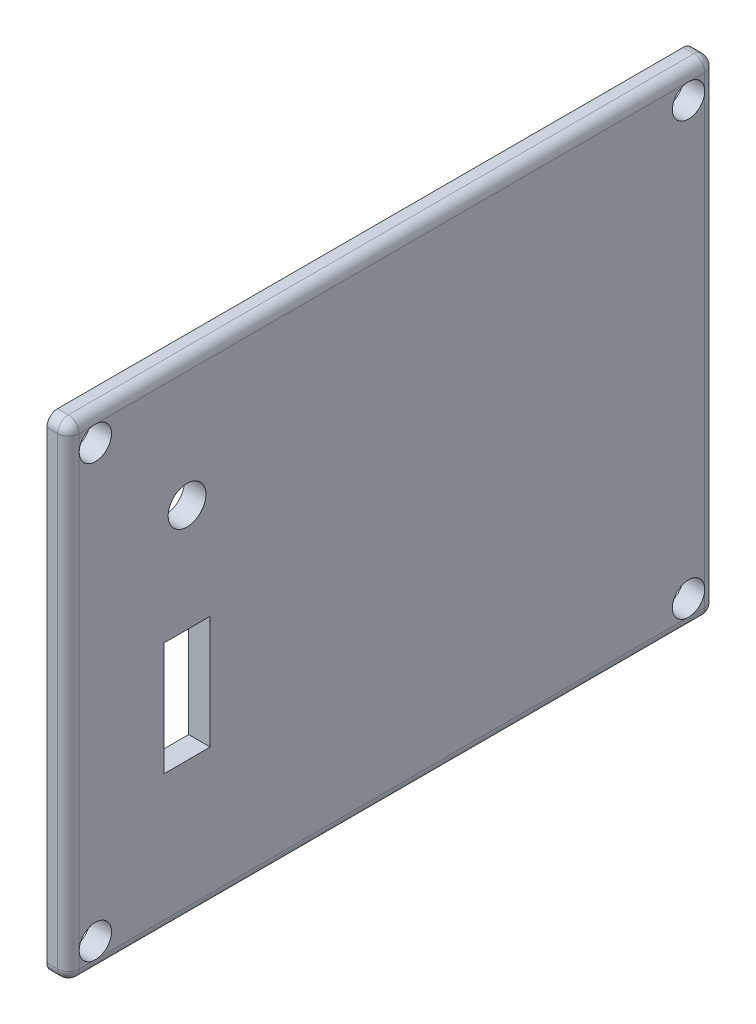
ISO-10303-21;
HEADER;
FILE_DESCRIPTION(('STEP AP214'),'2;1');
FILE_NAME('part.step','',(''),(''),'','','');
FILE_SCHEMA(('AUTOMOTIVE_DESIGN { 1 0 10303 214 1 1 1 1 }'));
ENDSEC;
DATA;
#1=APPLICATION_CONTEXT('core data for automotive mechanical design processes');
#2=APPLICATION_PROTOCOL_DEFINITION('international standard','automotive_design',2000,#1);
#3=PRODUCT_CONTEXT('',#1,'mechanical');
#4=PRODUCT('Part','Part','',(#3));
#5=PRODUCT_RELATED_PRODUCT_CATEGORY('part','',(#4));
#6=PRODUCT_DEFINITION_FORMATION('','',#4);
#7=PRODUCT_DEFINITION_CONTEXT('part definition',#1,'design');
#8=PRODUCT_DEFINITION('design','',#6,#7);
#9=PRODUCT_DEFINITION_SHAPE('','',#8);
#10=(LENGTH_UNIT() NAMED_UNIT(*) SI_UNIT(.MILLI.,.METRE.));
#11=(NAMED_UNIT(*) PLANE_ANGLE_UNIT() SI_UNIT($,.RADIAN.));
#12=(NAMED_UNIT(*) SI_UNIT($,.STERADIAN.) SOLID_ANGLE_UNIT());
#13=UNCERTAINTY_MEASURE_WITH_UNIT(LENGTH_MEASURE(1.E-05),#10,'distance_accuracy_value','');
#14=(GEOMETRIC_REPRESENTATION_CONTEXT(3) GLOBAL_UNCERTAINTY_ASSIGNED_CONTEXT((#13)) GLOBAL_UNIT_ASSIGNED_CONTEXT((#10,
#11,#12)) REPRESENTATION_CONTEXT('',''));
#15=CARTESIAN_POINT('',(0.,0.,0.));
#16=DIRECTION('',(0.,0.,1.));
#17=DIRECTION('',(1.,0.,0.));
#18=AXIS2_PLACEMENT_3D('',#15,#16,#17);
#19=CARTESIAN_POINT('',(2.,0.,0.));
#20=DIRECTION('',(-1.,0.,0.));
#21=DIRECTION('',(0.,0.,1.));
#22=AXIS2_PLACEMENT_3D('',#19,#20,#21);
#23=PLANE('',#22);
#24=DIRECTION('',(0.,0.,1.));
#25=VECTOR('',#24,1.);
#26=CARTESIAN_POINT('',(2.,0.750000000000006,21.15));
#27=LINE('',#26,#25);
#28=CARTESIAN_POINT('',(2.,0.750000000000006,16.85));
#29=VERTEX_POINT('',#28);
#30=CARTESIAN_POINT('',(2.,0.750000000000006,21.15));
#31=VERTEX_POINT('',#30);
#32=EDGE_CURVE('E179',#29,#31,#27,.T.);
#33=ORIENTED_EDGE('',*,*,#32,.F.);
#34=DIRECTION('',(0.,1.,0.));
#35=VECTOR('',#34,1.);
#36=CARTESIAN_POINT('',(2.,0.750000000000006,16.85));
#37=LINE('',#36,#35);
#38=CARTESIAN_POINT('',(2.,-9.74999999999999,16.85));
#39=VERTEX_POINT('',#38);
#40=EDGE_CURVE('E57',#39,#29,#37,.T.);
#41=ORIENTED_EDGE('',*,*,#40,.F.);
#42=DIRECTION('',(0.,0.,-1.));
#43=VECTOR('',#42,1.);
#44=CARTESIAN_POINT('',(2.,-9.74999999999999,21.15));
#45=LINE('',#44,#43);
#46=CARTESIAN_POINT('',(2.,-9.74999999999999,21.15));
#47=VERTEX_POINT('',#46);
#48=EDGE_CURVE('E186',#47,#39,#45,.T.);
#49=ORIENTED_EDGE('',*,*,#48,.F.);
#50=DIRECTION('',(0.,-1.,0.));
#51=VECTOR('',#50,1.);
#52=CARTESIAN_POINT('',(2.,0.750000000000006,21.15));
#53=LINE('',#52,#51);
#54=EDGE_CURVE('E169',#31,#47,#53,.T.);
#55=ORIENTED_EDGE('',*,*,#54,.F.);
#56=EDGE_LOOP('',(#33,#41,#49,#55));
#57=FACE_BOUND('',#56,.T.);
#58=CARTESIAN_POINT('',(2.,10.75,19.));
#59=DIRECTION('',(1.,0.,0.));
#60=DIRECTION('',(0.,0.,-1.));
#61=AXIS2_PLACEMENT_3D('',#58,#59,#60);
#62=CIRCLE('',#61,1.75);
#63=CARTESIAN_POINT('',(2.,10.75,17.25));
#64=VERTEX_POINT('',#63);
#65=EDGE_CURVE('E201',#64,#64,#62,.T.);
#66=ORIENTED_EDGE('',*,*,#65,.F.);
#67=EDGE_LOOP('',(#66));
#68=FACE_BOUND('',#67,.T.);
#69=CARTESIAN_POINT('',(2.,-20.,27.5));
#70=DIRECTION('',(1.,0.,0.));
#71=DIRECTION('',(0.,0.,-1.));
#72=AXIS2_PLACEMENT_3D('',#69,#70,#71);
#73=CIRCLE('',#72,1.49999999999999);
#74=CARTESIAN_POINT('',(2.,-21.5,27.5));
#75=VERTEX_POINT('',#74);
#76=CARTESIAN_POINT('',(2.,-20.,29.));
#77=VERTEX_POINT('',#76);
#78=EDGE_CURVE('E229',#75,#77,#73,.T.);
#79=ORIENTED_EDGE('',*,*,#78,.F.);
#80=DIRECTION('',(0.,0.,-1.));
#81=VECTOR('',#80,1.);
#82=CARTESIAN_POINT('',(2.,-21.5,0.));
#83=LINE('',#82,#81);
#84=CARTESIAN_POINT('',(2.,-21.5,-27.5));
#85=VERTEX_POINT('',#84);
#86=EDGE_CURVE('E344',#75,#85,#83,.T.);
#87=ORIENTED_EDGE('',*,*,#86,.T.);
#88=CARTESIAN_POINT('',(2.,-20.,-27.5));
#89=DIRECTION('',(1.,0.,0.));
#90=DIRECTION('',(0.,0.,-1.));
#91=AXIS2_PLACEMENT_3D('',#88,#89,#90);
#92=CIRCLE('',#91,1.49999999999999);
#93=CARTESIAN_POINT('',(2.,-20.,-29.));
#94=VERTEX_POINT('',#93);
#95=EDGE_CURVE('E221',#94,#85,#92,.T.);
#96=ORIENTED_EDGE('',*,*,#95,.F.);
#97=DIRECTION('',(0.,1.,0.));
#98=VECTOR('',#97,1.);
#99=CARTESIAN_POINT('',(2.,0.,-29.));
#100=LINE('',#99,#98);
#101=CARTESIAN_POINT('',(2.,20.,-29.));
#102=VERTEX_POINT('',#101);
#103=EDGE_CURVE('E334',#94,#102,#100,.T.);
#104=ORIENTED_EDGE('',*,*,#103,.T.);
#105=CARTESIAN_POINT('',(2.,20.,-27.5));
#106=DIRECTION('',(1.,0.,0.));
#107=DIRECTION('',(0.,0.,-1.));
#108=AXIS2_PLACEMENT_3D('',#105,#106,#107);
#109=CIRCLE('',#108,1.49999999999999);
#110=CARTESIAN_POINT('',(2.,21.5,-27.5));
#111=VERTEX_POINT('',#110);
#112=EDGE_CURVE('E216',#111,#102,#109,.T.);
#113=ORIENTED_EDGE('',*,*,#112,.F.);
#114=DIRECTION('',(0.,0.,1.));
#115=VECTOR('',#114,1.);
#116=CARTESIAN_POINT('',(2.,21.5,0.));
#117=LINE('',#116,#115);
#118=CARTESIAN_POINT('',(2.,21.5,27.5));
#119=VERTEX_POINT('',#118);
#120=EDGE_CURVE('E322',#111,#119,#117,.T.);
#121=ORIENTED_EDGE('',*,*,#120,.T.);
#122=CARTESIAN_POINT('',(2.,20.,27.5));
#123=DIRECTION('',(1.,0.,0.));
#124=DIRECTION('',(0.,0.,-1.));
#125=AXIS2_PLACEMENT_3D('',#122,#123,#124);
#126=CIRCLE('',#125,1.49999999999999);
#127=CARTESIAN_POINT('',(2.,20.,29.));
#128=VERTEX_POINT('',#127);
#129=EDGE_CURVE('E210',#128,#119,#126,.T.);
#130=ORIENTED_EDGE('',*,*,#129,.F.);
#131=DIRECTION('',(0.,-1.,0.));
#132=VECTOR('',#131,1.);
#133=CARTESIAN_POINT('',(2.,0.,29.));
#134=LINE('',#133,#132);
#135=EDGE_CURVE('E313',#128,#77,#134,.T.);
#136=ORIENTED_EDGE('',*,*,#135,.T.);
#137=EDGE_LOOP('',(#79,#87,#96,#104,#113,#121,#130,#136));
#138=FACE_BOUND('',#137,.T.);
#139=ADVANCED_FACE('F41',(#57,#68,#138),#23,.F.);
#140=EDGE_CURVE('E220',#85,#94,#92,.T.);
#141=ORIENTED_EDGE('',*,*,#140,.F.);
#142=DIRECTION('',(0.,0.,-1.));
#143=VECTOR('',#142,1.);
#144=CARTESIAN_POINT('',(2.,-21.5,0.));
#145=LINE('',#144,#143);
#146=CARTESIAN_POINT('',(2.,-21.5,-29.));
#147=VERTEX_POINT('',#146);
#148=EDGE_CURVE('E341',#85,#147,#145,.T.);
#149=ORIENTED_EDGE('',*,*,#148,.T.);
#150=DIRECTION('',(0.,1.,0.));
#151=VECTOR('',#150,1.);
#152=CARTESIAN_POINT('',(2.,0.,-29.));
#153=LINE('',#152,#151);
#154=EDGE_CURVE('E337',#147,#94,#153,.T.);
#155=ORIENTED_EDGE('',*,*,#154,.T.);
#156=EDGE_LOOP('',(#141,#149,#155));
#157=FACE_BOUND('',#156,.T.);
#158=ADVANCED_FACE('F421',(#157),#23,.F.);
#159=EDGE_CURVE('E211',#102,#111,#109,.T.);
#160=ORIENTED_EDGE('',*,*,#159,.F.);
#161=DIRECTION('',(0.,1.,0.));
#162=VECTOR('',#161,1.);
#163=CARTESIAN_POINT('',(2.,0.,-29.));
#164=LINE('',#163,#162);
#165=CARTESIAN_POINT('',(2.,21.5,-29.));
#166=VERTEX_POINT('',#165);
#167=EDGE_CURVE('E331',#102,#166,#164,.T.);
#168=ORIENTED_EDGE('',*,*,#167,.T.);
#169=DIRECTION('',(0.,0.,1.));
#170=VECTOR('',#169,1.);
#171=CARTESIAN_POINT('',(2.,21.5,0.));
#172=LINE('',#171,#170);
#173=EDGE_CURVE('E325',#166,#111,#172,.T.);
#174=ORIENTED_EDGE('',*,*,#173,.T.);
#175=EDGE_LOOP('',(#160,#168,#174));
#176=FACE_BOUND('',#175,.T.);
#177=ADVANCED_FACE('F427',(#176),#23,.F.);
#178=DIRECTION('',(0.,-1.,0.));
#179=VECTOR('',#178,1.);
#180=CARTESIAN_POINT('',(2.,0.,29.));
#181=LINE('',#180,#179);
#182=CARTESIAN_POINT('',(2.,-21.5,29.));
#183=VERTEX_POINT('',#182);
#184=EDGE_CURVE('E310',#77,#183,#181,.T.);
#185=ORIENTED_EDGE('',*,*,#184,.T.);
#186=DIRECTION('',(0.,0.,-1.));
#187=VECTOR('',#186,1.);
#188=CARTESIAN_POINT('',(2.,-21.5,0.));
#189=LINE('',#188,#187);
#190=EDGE_CURVE('E328',#183,#75,#189,.T.);
#191=ORIENTED_EDGE('',*,*,#190,.T.);
#192=EDGE_CURVE('E230',#77,#75,#73,.T.);
#193=ORIENTED_EDGE('',*,*,#192,.F.);
#194=EDGE_LOOP('',(#185,#191,#193));
#195=FACE_BOUND('',#194,.T.);
#196=ADVANCED_FACE('F434',(#195),#23,.F.);
#197=CARTESIAN_POINT('',(2.,-22.5,-30.));
#198=DIRECTION('',(0.,0.,1.));
#199=DIRECTION('',(1.,0.,0.));
#200=AXIS2_PLACEMENT_3D('',#197,#198,#199);
#201=PLANE('',#200);
#202=DIRECTION('',(-1.,0.,0.));
#203=VECTOR('',#202,1.);
#204=CARTESIAN_POINT('',(2.,21.5,-30.));
#205=LINE('',#204,#203);
#206=CARTESIAN_POINT('',(0.,21.5,-30.));
#207=VERTEX_POINT('',#206);
#208=CARTESIAN_POINT('',(1.,21.5,-30.));
#209=VERTEX_POINT('',#208);
#210=EDGE_CURVE('E254',#207,#209,#205,.F.);
#211=ORIENTED_EDGE('',*,*,#210,.T.);
#212=DIRECTION('',(0.,1.,0.));
#213=VECTOR('',#212,1.);
#214=CARTESIAN_POINT('',(1.,-22.5,-30.));
#215=LINE('',#214,#213);
#216=CARTESIAN_POINT('',(1.,-21.5,-30.));
#217=VERTEX_POINT('',#216);
#218=EDGE_CURVE('E347',#209,#217,#215,.F.);
#219=ORIENTED_EDGE('',*,*,#218,.T.);
#220=DIRECTION('',(-1.,0.,0.));
#221=VECTOR('',#220,1.);
#222=CARTESIAN_POINT('',(2.,-21.5,-30.));
#223=LINE('',#222,#221);
#224=CARTESIAN_POINT('',(0.,-21.5,-30.));
#225=VERTEX_POINT('',#224);
#226=EDGE_CURVE('E261',#217,#225,#223,.T.);
#227=ORIENTED_EDGE('',*,*,#226,.T.);
#228=DIRECTION('',(0.,1.,0.));
#229=VECTOR('',#228,1.);
#230=CARTESIAN_POINT('',(0.,-22.5,-30.));
#231=LINE('',#230,#229);
#232=EDGE_CURVE('E238',#225,#207,#231,.T.);
#233=ORIENTED_EDGE('',*,*,#232,.T.);
#234=EDGE_LOOP('',(#211,#219,#227,#233));
#235=FACE_BOUND('',#234,.T.);
#236=ADVANCED_FACE('F445',(#235),#201,.F.);
#237=CARTESIAN_POINT('',(2.,22.5,30.));
#238=DIRECTION('',(0.,-1.,0.));
#239=DIRECTION('',(0.,0.,-1.));
#240=AXIS2_PLACEMENT_3D('',#237,#238,#239);
#241=PLANE('',#240);
#242=DIRECTION('',(-1.,0.,0.));
#243=VECTOR('',#242,1.);
#244=CARTESIAN_POINT('',(2.,22.5,29.));
#245=LINE('',#244,#243);
#246=CARTESIAN_POINT('',(0.,22.5,29.));
#247=VERTEX_POINT('',#246);
#248=CARTESIAN_POINT('',(1.,22.5,29.));
#249=VERTEX_POINT('',#248);
#250=EDGE_CURVE('E290',#247,#249,#245,.F.);
#251=ORIENTED_EDGE('',*,*,#250,.T.);
#252=DIRECTION('',(0.,0.,1.));
#253=VECTOR('',#252,1.);
#254=CARTESIAN_POINT('',(1.,22.5,30.));
#255=LINE('',#254,#253);
#256=CARTESIAN_POINT('',(1.,22.5,-29.));
#257=VERTEX_POINT('',#256);
#258=EDGE_CURVE('E353',#249,#257,#255,.F.);
#259=ORIENTED_EDGE('',*,*,#258,.T.);
#260=DIRECTION('',(-1.,0.,0.));
#261=VECTOR('',#260,1.);
#262=CARTESIAN_POINT('',(2.,22.5,-29.));
#263=LINE('',#262,#261);
#264=CARTESIAN_POINT('',(0.,22.5,-29.));
#265=VERTEX_POINT('',#264);
#266=EDGE_CURVE('E294',#257,#265,#263,.T.);
#267=ORIENTED_EDGE('',*,*,#266,.T.);
#268=DIRECTION('',(0.,0.,1.));
#269=VECTOR('',#268,1.);
#270=CARTESIAN_POINT('',(0.,22.5,30.));
#271=LINE('',#270,#269);
#272=EDGE_CURVE('E242',#265,#247,#271,.T.);
#273=ORIENTED_EDGE('',*,*,#272,.T.);
#274=EDGE_LOOP('',(#251,#259,#267,#273));
#275=FACE_BOUND('',#274,.T.);
#276=ADVANCED_FACE('F451',(#275),#241,.F.);
#277=CARTESIAN_POINT('',(2.,-22.5,30.));
#278=DIRECTION('',(0.,0.,-1.));
#279=DIRECTION('',(-1.,0.,0.));
#280=AXIS2_PLACEMENT_3D('',#277,#278,#279);
#281=PLANE('',#280);
#282=DIRECTION('',(-1.,0.,0.));
#283=VECTOR('',#282,1.);
#284=CARTESIAN_POINT('',(2.,-21.5,30.));
#285=LINE('',#284,#283);
#286=CARTESIAN_POINT('',(0.,-21.5,30.));
#287=VERTEX_POINT('',#286);
#288=CARTESIAN_POINT('',(1.,-21.5,30.));
#289=VERTEX_POINT('',#288);
#290=EDGE_CURVE('E286',#287,#289,#285,.F.);
#291=ORIENTED_EDGE('',*,*,#290,.T.);
#292=DIRECTION('',(0.,-1.,0.));
#293=VECTOR('',#292,1.);
#294=CARTESIAN_POINT('',(1.,-22.5,30.));
#295=LINE('',#294,#293);
#296=CARTESIAN_POINT('',(1.,21.5,30.));
#297=VERTEX_POINT('',#296);
#298=EDGE_CURVE('E356',#289,#297,#295,.F.);
#299=ORIENTED_EDGE('',*,*,#298,.T.);
#300=DIRECTION('',(-1.,0.,0.));
#301=VECTOR('',#300,1.);
#302=CARTESIAN_POINT('',(2.,21.5,30.));
#303=LINE('',#302,#301);
#304=CARTESIAN_POINT('',(0.,21.5,30.));
#305=VERTEX_POINT('',#304);
#306=EDGE_CURVE('E283',#297,#305,#303,.T.);
#307=ORIENTED_EDGE('',*,*,#306,.T.);
#308=DIRECTION('',(0.,-1.,0.));
#309=VECTOR('',#308,1.);
#310=CARTESIAN_POINT('',(0.,-22.5,30.));
#311=LINE('',#310,#309);
#312=EDGE_CURVE('E246',#305,#287,#311,.T.);
#313=ORIENTED_EDGE('',*,*,#312,.T.);
#314=EDGE_LOOP('',(#291,#299,#307,#313));
#315=FACE_BOUND('',#314,.T.);
#316=ADVANCED_FACE('F440',(#315),#281,.F.);
#317=CARTESIAN_POINT('',(2.,-22.5,30.));
#318=DIRECTION('',(0.,1.,0.));
#319=DIRECTION('',(0.,0.,1.));
#320=AXIS2_PLACEMENT_3D('',#317,#318,#319);
#321=PLANE('',#320);
#322=DIRECTION('',(-1.,0.,0.));
#323=VECTOR('',#322,1.);
#324=CARTESIAN_POINT('',(2.,-22.5,-29.));
#325=LINE('',#324,#323);
#326=CARTESIAN_POINT('',(0.,-22.5,-29.));
#327=VERTEX_POINT('',#326);
#328=CARTESIAN_POINT('',(1.,-22.5,-29.));
#329=VERTEX_POINT('',#328);
#330=EDGE_CURVE('E279',#327,#329,#325,.F.);
#331=ORIENTED_EDGE('',*,*,#330,.T.);
#332=DIRECTION('',(0.,0.,-1.));
#333=VECTOR('',#332,1.);
#334=CARTESIAN_POINT('',(1.,-22.5,30.));
#335=LINE('',#334,#333);
#336=CARTESIAN_POINT('',(1.,-22.5,29.));
#337=VERTEX_POINT('',#336);
#338=EDGE_CURVE('E350',#329,#337,#335,.F.);
#339=ORIENTED_EDGE('',*,*,#338,.T.);
#340=DIRECTION('',(-1.,0.,0.));
#341=VECTOR('',#340,1.);
#342=CARTESIAN_POINT('',(2.,-22.5,29.));
#343=LINE('',#342,#341);
#344=CARTESIAN_POINT('',(0.,-22.5,29.));
#345=VERTEX_POINT('',#344);
#346=EDGE_CURVE('E276',#337,#345,#343,.T.);
#347=ORIENTED_EDGE('',*,*,#346,.T.);
#348=DIRECTION('',(0.,0.,-1.));
#349=VECTOR('',#348,1.);
#350=CARTESIAN_POINT('',(0.,-22.5,30.));
#351=LINE('',#350,#349);
#352=EDGE_CURVE('E250',#345,#327,#351,.T.);
#353=ORIENTED_EDGE('',*,*,#352,.T.);
#354=EDGE_LOOP('',(#331,#339,#347,#353));
#355=FACE_BOUND('',#354,.T.);
#356=ADVANCED_FACE('F432',(#355),#321,.F.);
#357=EDGE_CURVE('E205',#119,#128,#126,.T.);
#358=ORIENTED_EDGE('',*,*,#357,.F.);
#359=DIRECTION('',(0.,0.,1.));
#360=VECTOR('',#359,1.);
#361=CARTESIAN_POINT('',(2.,21.5,0.));
#362=LINE('',#361,#360);
#363=CARTESIAN_POINT('',(2.,21.5,29.));
#364=VERTEX_POINT('',#363);
#365=EDGE_CURVE('E319',#119,#364,#362,.T.);
#366=ORIENTED_EDGE('',*,*,#365,.T.);
#367=DIRECTION('',(0.,-1.,0.));
#368=VECTOR('',#367,1.);
#369=CARTESIAN_POINT('',(2.,0.,29.));
#370=LINE('',#369,#368);
#371=EDGE_CURVE('E316',#364,#128,#370,.T.);
#372=ORIENTED_EDGE('',*,*,#371,.T.);
#373=EDGE_LOOP('',(#358,#366,#372));
#374=FACE_BOUND('',#373,.T.);
#375=ADVANCED_FACE('F423',(#374),#23,.F.);
#376=CARTESIAN_POINT('',(0.,0.,0.));
#377=DIRECTION('',(-1.,0.,0.));
#378=DIRECTION('',(0.,0.,1.));
#379=AXIS2_PLACEMENT_3D('',#376,#377,#378);
#380=PLANE('',#379);
#381=DIRECTION('',(0.,-1.,0.));
#382=VECTOR('',#381,1.);
#383=CARTESIAN_POINT('',(0.,0.,16.85));
#384=LINE('',#383,#382);
#385=CARTESIAN_POINT('',(0.,0.750000000000006,16.85));
#386=VERTEX_POINT('',#385);
#387=CARTESIAN_POINT('',(0.,-9.74999999999999,16.85));
#388=VERTEX_POINT('',#387);
#389=EDGE_CURVE('E11',#386,#388,#384,.T.);
#390=ORIENTED_EDGE('',*,*,#389,.F.);
#391=DIRECTION('',(0.,0.,-1.));
#392=VECTOR('',#391,1.);
#393=CARTESIAN_POINT('',(0.,0.750000000000006,0.));
#394=LINE('',#393,#392);
#395=CARTESIAN_POINT('',(0.,0.750000000000006,21.15));
#396=VERTEX_POINT('',#395);
#397=EDGE_CURVE('E359',#396,#386,#394,.T.);
#398=ORIENTED_EDGE('',*,*,#397,.F.);
#399=DIRECTION('',(0.,1.,0.));
#400=VECTOR('',#399,1.);
#401=CARTESIAN_POINT('',(0.,0.,21.15));
#402=LINE('',#401,#400);
#403=CARTESIAN_POINT('',(0.,-9.74999999999999,21.15));
#404=VERTEX_POINT('',#403);
#405=EDGE_CURVE('E172',#404,#396,#402,.T.);
#406=ORIENTED_EDGE('',*,*,#405,.F.);
#407=DIRECTION('',(0.,0.,1.));
#408=VECTOR('',#407,1.);
#409=CARTESIAN_POINT('',(0.,-9.74999999999999,0.));
#410=LINE('',#409,#408);
#411=EDGE_CURVE('E50',#388,#404,#410,.T.);
#412=ORIENTED_EDGE('',*,*,#411,.F.);
#413=EDGE_LOOP('',(#390,#398,#406,#412));
#414=FACE_BOUND('',#413,.T.);
#415=CARTESIAN_POINT('',(0.,10.75,19.));
#416=DIRECTION('',(-1.,0.,0.));
#417=DIRECTION('',(0.,0.,1.));
#418=AXIS2_PLACEMENT_3D('',#415,#416,#417);
#419=CIRCLE('',#418,1.75);
#420=CARTESIAN_POINT('',(0.,10.75,20.75));
#421=VERTEX_POINT('',#420);
#422=EDGE_CURVE('E196',#421,#421,#419,.T.);
#423=ORIENTED_EDGE('',*,*,#422,.F.);
#424=EDGE_LOOP('',(#423));
#425=FACE_BOUND('',#424,.T.);
#426=CARTESIAN_POINT('',(0.,20.,27.5));
#427=DIRECTION('',(-1.,0.,0.));
#428=DIRECTION('',(0.,0.,1.));
#429=AXIS2_PLACEMENT_3D('',#426,#427,#428);
#430=CIRCLE('',#429,1.49999999999999);
#431=CARTESIAN_POINT('',(0.,20.,29.));
#432=VERTEX_POINT('',#431);
#433=EDGE_CURVE('E209',#432,#432,#430,.T.);
#434=ORIENTED_EDGE('',*,*,#433,.F.);
#435=EDGE_LOOP('',(#434));
#436=FACE_BOUND('',#435,.T.);
#437=CARTESIAN_POINT('',(0.,20.,-27.5));
#438=DIRECTION('',(-1.,0.,0.));
#439=DIRECTION('',(0.,0.,1.));
#440=AXIS2_PLACEMENT_3D('',#437,#438,#439);
#441=CIRCLE('',#440,1.49999999999999);
#442=CARTESIAN_POINT('',(0.,20.,-26.));
#443=VERTEX_POINT('',#442);
#444=EDGE_CURVE('E215',#443,#443,#441,.T.);
#445=ORIENTED_EDGE('',*,*,#444,.F.);
#446=EDGE_LOOP('',(#445));
#447=FACE_BOUND('',#446,.T.);
#448=CARTESIAN_POINT('',(0.,-20.,-27.5));
#449=DIRECTION('',(-1.,0.,0.));
#450=DIRECTION('',(0.,0.,1.));
#451=AXIS2_PLACEMENT_3D('',#448,#449,#450);
#452=CIRCLE('',#451,1.49999999999999);
#453=CARTESIAN_POINT('',(0.,-20.,-26.));
#454=VERTEX_POINT('',#453);
#455=EDGE_CURVE('E225',#454,#454,#452,.T.);
#456=ORIENTED_EDGE('',*,*,#455,.F.);
#457=EDGE_LOOP('',(#456));
#458=FACE_BOUND('',#457,.T.);
#459=CARTESIAN_POINT('',(0.,-20.,27.5));
#460=DIRECTION('',(-1.,0.,0.));
#461=DIRECTION('',(0.,0.,1.));
#462=AXIS2_PLACEMENT_3D('',#459,#460,#461);
#463=CIRCLE('',#462,1.49999999999999);
#464=CARTESIAN_POINT('',(0.,-20.,29.));
#465=VERTEX_POINT('',#464);
#466=EDGE_CURVE('E234',#465,#465,#463,.T.);
#467=ORIENTED_EDGE('',*,*,#466,.F.);
#468=EDGE_LOOP('',(#467));
#469=FACE_BOUND('',#468,.T.);
#470=ORIENTED_EDGE('',*,*,#232,.F.);
#471=CARTESIAN_POINT('',(0.,-21.5,-29.));
#472=DIRECTION('',(-1.,0.,0.));
#473=DIRECTION('',(0.,0.,1.));
#474=AXIS2_PLACEMENT_3D('',#471,#472,#473);
#475=CIRCLE('',#474,1.);
#476=EDGE_CURVE('E273',#225,#327,#475,.T.);
#477=ORIENTED_EDGE('',*,*,#476,.T.);
#478=ORIENTED_EDGE('',*,*,#352,.F.);
#479=CARTESIAN_POINT('',(0.,-21.5,29.));
#480=DIRECTION('',(-1.,0.,0.));
#481=DIRECTION('',(0.,0.,1.));
#482=AXIS2_PLACEMENT_3D('',#479,#480,#481);
#483=CIRCLE('',#482,1.);
#484=EDGE_CURVE('E270',#345,#287,#483,.T.);
#485=ORIENTED_EDGE('',*,*,#484,.T.);
#486=ORIENTED_EDGE('',*,*,#312,.F.);
#487=CARTESIAN_POINT('',(0.,21.5,29.));
#488=DIRECTION('',(-1.,0.,0.));
#489=DIRECTION('',(0.,0.,1.));
#490=AXIS2_PLACEMENT_3D('',#487,#488,#489);
#491=CIRCLE('',#490,1.);
#492=EDGE_CURVE('E264',#305,#247,#491,.T.);
#493=ORIENTED_EDGE('',*,*,#492,.T.);
#494=ORIENTED_EDGE('',*,*,#272,.F.);
#495=CARTESIAN_POINT('',(0.,21.5,-29.));
#496=DIRECTION('',(-1.,0.,0.));
#497=DIRECTION('',(0.,0.,1.));
#498=AXIS2_PLACEMENT_3D('',#495,#496,#497);
#499=CIRCLE('',#498,1.);
#500=EDGE_CURVE('E267',#265,#207,#499,.T.);
#501=ORIENTED_EDGE('',*,*,#500,.T.);
#502=EDGE_LOOP('',(#470,#477,#478,#485,#486,#493,#494,#501));
#503=FACE_BOUND('',#502,.T.);
#504=ADVANCED_FACE('F404',(#414,#425,#436,#447,#458,#469,#503),#380,.T.);
#505=CARTESIAN_POINT('',(2.,-20.,27.5));
#506=DIRECTION('',(1.,0.,0.));
#507=DIRECTION('',(0.,0.,-1.));
#508=AXIS2_PLACEMENT_3D('',#505,#506,#507);
#509=CYLINDRICAL_SURFACE('',#508,1.49999999999999);
#510=ORIENTED_EDGE('',*,*,#466,.T.);
#511=EDGE_LOOP('',(#510));
#512=FACE_BOUND('',#511,.T.);
#513=ORIENTED_EDGE('',*,*,#192,.T.);
#514=ORIENTED_EDGE('',*,*,#78,.T.);
#515=EDGE_LOOP('',(#513,#514));
#516=FACE_BOUND('',#515,.T.);
#517=ADVANCED_FACE('F439',(#512,#516),#509,.F.);
#518=CARTESIAN_POINT('',(2.,-20.,-27.5));
#519=DIRECTION('',(1.,0.,0.));
#520=DIRECTION('',(0.,0.,-1.));
#521=AXIS2_PLACEMENT_3D('',#518,#519,#520);
#522=CYLINDRICAL_SURFACE('',#521,1.49999999999999);
#523=ORIENTED_EDGE('',*,*,#455,.T.);
#524=EDGE_LOOP('',(#523));
#525=FACE_BOUND('',#524,.T.);
#526=ORIENTED_EDGE('',*,*,#95,.T.);
#527=ORIENTED_EDGE('',*,*,#140,.T.);
#528=EDGE_LOOP('',(#526,#527));
#529=FACE_BOUND('',#528,.T.);
#530=ADVANCED_FACE('F590',(#525,#529),#522,.F.);
#531=CARTESIAN_POINT('',(2.,20.,-27.5));
#532=DIRECTION('',(1.,0.,0.));
#533=DIRECTION('',(0.,0.,-1.));
#534=AXIS2_PLACEMENT_3D('',#531,#532,#533);
#535=CYLINDRICAL_SURFACE('',#534,1.49999999999999);
#536=ORIENTED_EDGE('',*,*,#444,.T.);
#537=EDGE_LOOP('',(#536));
#538=FACE_BOUND('',#537,.T.);
#539=ORIENTED_EDGE('',*,*,#159,.T.);
#540=ORIENTED_EDGE('',*,*,#112,.T.);
#541=EDGE_LOOP('',(#539,#540));
#542=FACE_BOUND('',#541,.T.);
#543=ADVANCED_FACE('F580',(#538,#542),#535,.F.);
#544=CARTESIAN_POINT('',(2.,20.,27.5));
#545=DIRECTION('',(1.,0.,0.));
#546=DIRECTION('',(0.,0.,-1.));
#547=AXIS2_PLACEMENT_3D('',#544,#545,#546);
#548=CYLINDRICAL_SURFACE('',#547,1.49999999999999);
#549=ORIENTED_EDGE('',*,*,#433,.T.);
#550=EDGE_LOOP('',(#549));
#551=FACE_BOUND('',#550,.T.);
#552=ORIENTED_EDGE('',*,*,#357,.T.);
#553=ORIENTED_EDGE('',*,*,#129,.T.);
#554=EDGE_LOOP('',(#552,#553));
#555=FACE_BOUND('',#554,.T.);
#556=ADVANCED_FACE('F531',(#551,#555),#548,.F.);
#557=CARTESIAN_POINT('',(2.,-21.5,-29.));
#558=DIRECTION('',(-1.,0.,0.));
#559=DIRECTION('',(0.,0.,1.));
#560=AXIS2_PLACEMENT_3D('',#557,#558,#559);
#561=CYLINDRICAL_SURFACE('',#560,1.);
#562=ORIENTED_EDGE('',*,*,#226,.F.);
#563=CARTESIAN_POINT('',(1.,-21.5,-29.));
#564=DIRECTION('',(-1.,0.,0.));
#565=DIRECTION('',(0.,0.,1.));
#566=AXIS2_PLACEMENT_3D('',#563,#564,#565);
#567=CIRCLE('',#566,1.);
#568=EDGE_CURVE('E304',#217,#329,#567,.T.);
#569=ORIENTED_EDGE('',*,*,#568,.T.);
#570=ORIENTED_EDGE('',*,*,#330,.F.);
#571=ORIENTED_EDGE('',*,*,#476,.F.);
#572=EDGE_LOOP('',(#562,#569,#570,#571));
#573=FACE_BOUND('',#572,.T.);
#574=ADVANCED_FACE('F513',(#573),#561,.T.);
#575=CARTESIAN_POINT('',(2.,-21.5,29.));
#576=DIRECTION('',(-1.,0.,0.));
#577=DIRECTION('',(0.,0.,1.));
#578=AXIS2_PLACEMENT_3D('',#575,#576,#577);
#579=CYLINDRICAL_SURFACE('',#578,1.);
#580=ORIENTED_EDGE('',*,*,#346,.F.);
#581=CARTESIAN_POINT('',(1.,-21.5,29.));
#582=DIRECTION('',(-1.,0.,0.));
#583=DIRECTION('',(0.,0.,1.));
#584=AXIS2_PLACEMENT_3D('',#581,#582,#583);
#585=CIRCLE('',#584,1.);
#586=EDGE_CURVE('E307',#337,#289,#585,.T.);
#587=ORIENTED_EDGE('',*,*,#586,.T.);
#588=ORIENTED_EDGE('',*,*,#290,.F.);
#589=ORIENTED_EDGE('',*,*,#484,.F.);
#590=EDGE_LOOP('',(#580,#587,#588,#589));
#591=FACE_BOUND('',#590,.T.);
#592=ADVANCED_FACE('F521',(#591),#579,.T.);
#593=CARTESIAN_POINT('',(2.,21.5,-29.));
#594=DIRECTION('',(-1.,0.,0.));
#595=DIRECTION('',(0.,0.,1.));
#596=AXIS2_PLACEMENT_3D('',#593,#594,#595);
#597=CYLINDRICAL_SURFACE('',#596,1.);
#598=ORIENTED_EDGE('',*,*,#266,.F.);
#599=CARTESIAN_POINT('',(1.,21.5,-29.));
#600=DIRECTION('',(-1.,0.,0.));
#601=DIRECTION('',(0.,0.,1.));
#602=AXIS2_PLACEMENT_3D('',#599,#600,#601);
#603=CIRCLE('',#602,1.);
#604=EDGE_CURVE('E301',#257,#209,#603,.T.);
#605=ORIENTED_EDGE('',*,*,#604,.T.);
#606=ORIENTED_EDGE('',*,*,#210,.F.);
#607=ORIENTED_EDGE('',*,*,#500,.F.);
#608=EDGE_LOOP('',(#598,#605,#606,#607));
#609=FACE_BOUND('',#608,.T.);
#610=ADVANCED_FACE('F497',(#609),#597,.T.);
#611=CARTESIAN_POINT('',(2.,21.5,29.));
#612=DIRECTION('',(-1.,0.,0.));
#613=DIRECTION('',(0.,0.,1.));
#614=AXIS2_PLACEMENT_3D('',#611,#612,#613);
#615=CYLINDRICAL_SURFACE('',#614,1.);
#616=ORIENTED_EDGE('',*,*,#306,.F.);
#617=CARTESIAN_POINT('',(1.,21.5,29.));
#618=DIRECTION('',(-1.,0.,0.));
#619=DIRECTION('',(0.,0.,1.));
#620=AXIS2_PLACEMENT_3D('',#617,#618,#619);
#621=CIRCLE('',#620,1.);
#622=EDGE_CURVE('E297',#297,#249,#621,.T.);
#623=ORIENTED_EDGE('',*,*,#622,.T.);
#624=ORIENTED_EDGE('',*,*,#250,.F.);
#625=ORIENTED_EDGE('',*,*,#492,.F.);
#626=EDGE_LOOP('',(#616,#623,#624,#625));
#627=FACE_BOUND('',#626,.T.);
#628=ADVANCED_FACE('F481',(#627),#615,.T.);
#629=CARTESIAN_POINT('',(1.,-21.5,-29.));
#630=DIRECTION('',(-1.,0.,0.));
#631=DIRECTION('',(0.,0.,1.));
#632=AXIS2_PLACEMENT_3D('',#629,#630,#631);
#633=SPHERICAL_SURFACE('',#632,1.);
#634=CARTESIAN_POINT('',(1.,-21.5,-29.));
#635=DIRECTION('',(0.,0.,1.));
#636=DIRECTION('',(1.,0.,0.));
#637=AXIS2_PLACEMENT_3D('',#634,#635,#636);
#638=CIRCLE('',#637,1.);
#639=EDGE_CURVE('E383',#329,#147,#638,.T.);
#640=ORIENTED_EDGE('',*,*,#639,.F.);
#641=ORIENTED_EDGE('',*,*,#568,.F.);
#642=CARTESIAN_POINT('',(1.,-21.5,-29.));
#643=DIRECTION('',(0.,1.,0.));
#644=DIRECTION('',(0.,0.,1.));
#645=AXIS2_PLACEMENT_3D('',#642,#643,#644);
#646=CIRCLE('',#645,1.);
#647=EDGE_CURVE('E387',#147,#217,#646,.T.);
#648=ORIENTED_EDGE('',*,*,#647,.F.);
#649=EDGE_LOOP('',(#640,#641,#648));
#650=FACE_BOUND('',#649,.T.);
#651=ADVANCED_FACE('F43',(#650),#633,.T.);
#652=CARTESIAN_POINT('',(1.,0.,-29.));
#653=DIRECTION('',(0.,1.,0.));
#654=DIRECTION('',(0.,0.,1.));
#655=AXIS2_PLACEMENT_3D('',#652,#653,#654);
#656=CYLINDRICAL_SURFACE('',#655,1.);
#657=ORIENTED_EDGE('',*,*,#647,.T.);
#658=ORIENTED_EDGE('',*,*,#218,.F.);
#659=CARTESIAN_POINT('',(1.,21.5,-29.));
#660=DIRECTION('',(0.,1.,0.));
#661=DIRECTION('',(0.,0.,1.));
#662=AXIS2_PLACEMENT_3D('',#659,#660,#661);
#663=CIRCLE('',#662,1.);
#664=EDGE_CURVE('E379',#166,#209,#663,.T.);
#665=ORIENTED_EDGE('',*,*,#664,.F.);
#666=ORIENTED_EDGE('',*,*,#167,.F.);
#667=ORIENTED_EDGE('',*,*,#103,.F.);
#668=ORIENTED_EDGE('',*,*,#154,.F.);
#669=EDGE_LOOP('',(#657,#658,#665,#666,#667,#668));
#670=FACE_BOUND('',#669,.T.);
#671=ADVANCED_FACE('F506',(#670),#656,.T.);
#672=CARTESIAN_POINT('',(1.,-21.5,0.));
#673=DIRECTION('',(0.,0.,-1.));
#674=DIRECTION('',(-1.,0.,0.));
#675=AXIS2_PLACEMENT_3D('',#672,#673,#674);
#676=CYLINDRICAL_SURFACE('',#675,1.);
#677=ORIENTED_EDGE('',*,*,#86,.F.);
#678=ORIENTED_EDGE('',*,*,#190,.F.);
#679=CARTESIAN_POINT('',(1.,-21.5,29.));
#680=DIRECTION('',(0.,0.,1.));
#681=DIRECTION('',(1.,0.,0.));
#682=AXIS2_PLACEMENT_3D('',#679,#680,#681);
#683=CIRCLE('',#682,1.);
#684=EDGE_CURVE('E375',#337,#183,#683,.T.);
#685=ORIENTED_EDGE('',*,*,#684,.F.);
#686=ORIENTED_EDGE('',*,*,#338,.F.);
#687=ORIENTED_EDGE('',*,*,#639,.T.);
#688=ORIENTED_EDGE('',*,*,#148,.F.);
#689=EDGE_LOOP('',(#677,#678,#685,#686,#687,#688));
#690=FACE_BOUND('',#689,.T.);
#691=ADVANCED_FACE('F464',(#690),#676,.T.);
#692=CARTESIAN_POINT('',(1.,21.5,-29.));
#693=DIRECTION('',(-1.,0.,0.));
#694=DIRECTION('',(0.,0.,1.));
#695=AXIS2_PLACEMENT_3D('',#692,#693,#694);
#696=SPHERICAL_SURFACE('',#695,1.);
#697=ORIENTED_EDGE('',*,*,#664,.T.);
#698=ORIENTED_EDGE('',*,*,#604,.F.);
#699=CARTESIAN_POINT('',(1.,21.5,-29.));
#700=DIRECTION('',(0.,0.,1.));
#701=DIRECTION('',(1.,0.,0.));
#702=AXIS2_PLACEMENT_3D('',#699,#700,#701);
#703=CIRCLE('',#702,1.);
#704=EDGE_CURVE('E371',#166,#257,#703,.T.);
#705=ORIENTED_EDGE('',*,*,#704,.F.);
#706=EDGE_LOOP('',(#697,#698,#705));
#707=FACE_BOUND('',#706,.T.);
#708=ADVANCED_FACE('F501',(#707),#696,.T.);
#709=CARTESIAN_POINT('',(1.,-21.5,29.));
#710=DIRECTION('',(-1.,0.,0.));
#711=DIRECTION('',(0.,0.,1.));
#712=AXIS2_PLACEMENT_3D('',#709,#710,#711);
#713=SPHERICAL_SURFACE('',#712,1.);
#714=ORIENTED_EDGE('',*,*,#586,.F.);
#715=ORIENTED_EDGE('',*,*,#684,.T.);
#716=CARTESIAN_POINT('',(1.,-21.5,29.));
#717=DIRECTION('',(0.,1.,0.));
#718=DIRECTION('',(0.,0.,1.));
#719=AXIS2_PLACEMENT_3D('',#716,#717,#718);
#720=CIRCLE('',#719,1.);
#721=EDGE_CURVE('E367',#289,#183,#720,.T.);
#722=ORIENTED_EDGE('',*,*,#721,.F.);
#723=EDGE_LOOP('',(#714,#715,#722));
#724=FACE_BOUND('',#723,.T.);
#725=ADVANCED_FACE('F470',(#724),#713,.T.);
#726=CARTESIAN_POINT('',(1.,21.5,0.));
#727=DIRECTION('',(0.,0.,1.));
#728=DIRECTION('',(1.,0.,0.));
#729=AXIS2_PLACEMENT_3D('',#726,#727,#728);
#730=CYLINDRICAL_SURFACE('',#729,1.);
#731=ORIENTED_EDGE('',*,*,#704,.T.);
#732=ORIENTED_EDGE('',*,*,#258,.F.);
#733=CARTESIAN_POINT('',(1.,21.5,29.));
#734=DIRECTION('',(0.,0.,1.));
#735=DIRECTION('',(1.,0.,0.));
#736=AXIS2_PLACEMENT_3D('',#733,#734,#735);
#737=CIRCLE('',#736,1.);
#738=EDGE_CURVE('E364',#364,#249,#737,.T.);
#739=ORIENTED_EDGE('',*,*,#738,.F.);
#740=ORIENTED_EDGE('',*,*,#365,.F.);
#741=ORIENTED_EDGE('',*,*,#120,.F.);
#742=ORIENTED_EDGE('',*,*,#173,.F.);
#743=EDGE_LOOP('',(#731,#732,#739,#740,#741,#742));
#744=FACE_BOUND('',#743,.T.);
#745=ADVANCED_FACE('F489',(#744),#730,.T.);
#746=CARTESIAN_POINT('',(1.,0.,29.));
#747=DIRECTION('',(0.,-1.,0.));
#748=DIRECTION('',(0.,0.,-1.));
#749=AXIS2_PLACEMENT_3D('',#746,#747,#748);
#750=CYLINDRICAL_SURFACE('',#749,1.);
#751=ORIENTED_EDGE('',*,*,#135,.F.);
#752=ORIENTED_EDGE('',*,*,#371,.F.);
#753=CARTESIAN_POINT('',(1.,21.5,29.));
#754=DIRECTION('',(0.,1.,0.));
#755=DIRECTION('',(0.,0.,1.));
#756=AXIS2_PLACEMENT_3D('',#753,#754,#755);
#757=CIRCLE('',#756,1.);
#758=EDGE_CURVE('E360',#297,#364,#757,.T.);
#759=ORIENTED_EDGE('',*,*,#758,.F.);
#760=ORIENTED_EDGE('',*,*,#298,.F.);
#761=ORIENTED_EDGE('',*,*,#721,.T.);
#762=ORIENTED_EDGE('',*,*,#184,.F.);
#763=EDGE_LOOP('',(#751,#752,#759,#760,#761,#762));
#764=FACE_BOUND('',#763,.T.);
#765=ADVANCED_FACE('F472',(#764),#750,.T.);
#766=CARTESIAN_POINT('',(1.,21.5,29.));
#767=DIRECTION('',(-1.,0.,0.));
#768=DIRECTION('',(0.,0.,1.));
#769=AXIS2_PLACEMENT_3D('',#766,#767,#768);
#770=SPHERICAL_SURFACE('',#769,1.);
#771=ORIENTED_EDGE('',*,*,#738,.T.);
#772=ORIENTED_EDGE('',*,*,#622,.F.);
#773=ORIENTED_EDGE('',*,*,#758,.T.);
#774=EDGE_LOOP('',(#771,#772,#773));
#775=FACE_BOUND('',#774,.T.);
#776=ADVANCED_FACE('F416',(#775),#770,.T.);
#777=CARTESIAN_POINT('',(-1.,10.75,19.));
#778=DIRECTION('',(1.,0.,0.));
#779=DIRECTION('',(0.,0.,-1.));
#780=AXIS2_PLACEMENT_3D('',#777,#778,#779);
#781=CYLINDRICAL_SURFACE('',#780,1.75);
#782=ORIENTED_EDGE('',*,*,#422,.T.);
#783=EDGE_LOOP('',(#782));
#784=FACE_BOUND('',#783,.T.);
#785=ORIENTED_EDGE('',*,*,#65,.T.);
#786=EDGE_LOOP('',(#785));
#787=FACE_BOUND('',#786,.T.);
#788=ADVANCED_FACE('F409',(#784,#787),#781,.F.);
#789=CARTESIAN_POINT('',(-1.,0.750000000000006,16.85));
#790=DIRECTION('',(0.,0.,-1.));
#791=DIRECTION('',(-1.,0.,0.));
#792=AXIS2_PLACEMENT_3D('',#789,#790,#791);
#793=PLANE('',#792);
#794=ORIENTED_EDGE('',*,*,#389,.T.);
#795=DIRECTION('',(1.,0.,0.));
#796=VECTOR('',#795,1.);
#797=CARTESIAN_POINT('',(-1.,-9.74999999999999,16.85));
#798=LINE('',#797,#796);
#799=EDGE_CURVE('E193',#388,#39,#798,.T.);
#800=ORIENTED_EDGE('',*,*,#799,.T.);
#801=ORIENTED_EDGE('',*,*,#40,.T.);
#802=DIRECTION('',(1.,0.,0.));
#803=VECTOR('',#802,1.);
#804=CARTESIAN_POINT('',(-1.,0.750000000000006,16.85));
#805=LINE('',#804,#803);
#806=EDGE_CURVE('E176',#386,#29,#805,.T.);
#807=ORIENTED_EDGE('',*,*,#806,.F.);
#808=EDGE_LOOP('',(#794,#800,#801,#807));
#809=FACE_BOUND('',#808,.T.);
#810=ADVANCED_FACE('F406',(#809),#793,.F.);
#811=CARTESIAN_POINT('',(-1.,-9.74999999999999,21.15));
#812=DIRECTION('',(0.,-1.,0.));
#813=DIRECTION('',(0.,0.,-1.));
#814=AXIS2_PLACEMENT_3D('',#811,#812,#813);
#815=PLANE('',#814);
#816=ORIENTED_EDGE('',*,*,#411,.T.);
#817=DIRECTION('',(1.,0.,0.));
#818=VECTOR('',#817,1.);
#819=CARTESIAN_POINT('',(-1.,-9.74999999999999,21.15));
#820=LINE('',#819,#818);
#821=EDGE_CURVE('E175',#404,#47,#820,.T.);
#822=ORIENTED_EDGE('',*,*,#821,.T.);
#823=ORIENTED_EDGE('',*,*,#48,.T.);
#824=ORIENTED_EDGE('',*,*,#799,.F.);
#825=EDGE_LOOP('',(#816,#822,#823,#824));
#826=FACE_BOUND('',#825,.T.);
#827=ADVANCED_FACE('F401',(#826),#815,.F.);
#828=CARTESIAN_POINT('',(-1.,0.750000000000006,21.15));
#829=DIRECTION('',(0.,0.,1.));
#830=DIRECTION('',(1.,0.,0.));
#831=AXIS2_PLACEMENT_3D('',#828,#829,#830);
#832=PLANE('',#831);
#833=ORIENTED_EDGE('',*,*,#405,.T.);
#834=DIRECTION('',(1.,0.,0.));
#835=VECTOR('',#834,1.);
#836=CARTESIAN_POINT('',(-1.,0.750000000000006,21.15));
#837=LINE('',#836,#835);
#838=EDGE_CURVE('E65',#396,#31,#837,.T.);
#839=ORIENTED_EDGE('',*,*,#838,.T.);
#840=ORIENTED_EDGE('',*,*,#54,.T.);
#841=ORIENTED_EDGE('',*,*,#821,.F.);
#842=EDGE_LOOP('',(#833,#839,#840,#841));
#843=FACE_BOUND('',#842,.T.);
#844=ADVANCED_FACE('F166',(#843),#832,.F.);
#845=CARTESIAN_POINT('',(-1.,0.750000000000006,21.15));
#846=DIRECTION('',(0.,1.,0.));
#847=DIRECTION('',(0.,0.,1.));
#848=AXIS2_PLACEMENT_3D('',#845,#846,#847);
#849=PLANE('',#848);
#850=ORIENTED_EDGE('',*,*,#397,.T.);
#851=ORIENTED_EDGE('',*,*,#806,.T.);
#852=ORIENTED_EDGE('',*,*,#32,.T.);
#853=ORIENTED_EDGE('',*,*,#838,.F.);
#854=EDGE_LOOP('',(#850,#851,#852,#853));
#855=FACE_BOUND('',#854,.T.);
#856=ADVANCED_FACE('F180',(#855),#849,.F.);
#857=CLOSED_SHELL('',(#139,#158,#177,#196,#236,#276,#316,#356,#375,#504,#517,#530,#543,#556,
#574,#592,#610,#628,#651,#671,#691,#708,#725,#745,#765,#776,#788,#810,#827,#844,#856));
#858=MANIFOLD_SOLID_BREP('B2',#857);
#859=ADVANCED_BREP_SHAPE_REPRESENTATION('',(#18,#858),#14);
#860=SHAPE_DEFINITION_REPRESENTATION(#9,#859);
ENDSEC;
END-ISO-10303-21;
